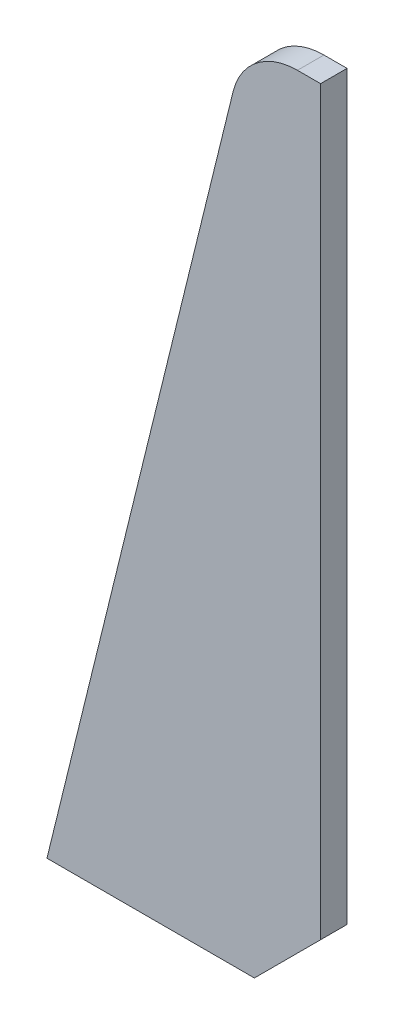
ISO-10303-21;
HEADER;
FILE_DESCRIPTION(('STEP AP214'),'2;1');
FILE_NAME('part.step','',(''),(''),'','','');
FILE_SCHEMA(('AUTOMOTIVE_DESIGN { 1 0 10303 214 1 1 1 1 }'));
ENDSEC;
DATA;
#1=APPLICATION_CONTEXT('core data for automotive mechanical design processes');
#2=APPLICATION_PROTOCOL_DEFINITION('international standard','automotive_design',2000,#1);
#3=PRODUCT_CONTEXT('',#1,'mechanical');
#4=PRODUCT('Part','Part','',(#3));
#5=PRODUCT_RELATED_PRODUCT_CATEGORY('part','',(#4));
#6=PRODUCT_DEFINITION_FORMATION('','',#4);
#7=PRODUCT_DEFINITION_CONTEXT('part definition',#1,'design');
#8=PRODUCT_DEFINITION('design','',#6,#7);
#9=PRODUCT_DEFINITION_SHAPE('','',#8);
#10=(LENGTH_UNIT() NAMED_UNIT(*) SI_UNIT(.MILLI.,.METRE.));
#11=(NAMED_UNIT(*) PLANE_ANGLE_UNIT() SI_UNIT($,.RADIAN.));
#12=(NAMED_UNIT(*) SI_UNIT($,.STERADIAN.) SOLID_ANGLE_UNIT());
#13=UNCERTAINTY_MEASURE_WITH_UNIT(LENGTH_MEASURE(1.E-05),#10,'distance_accuracy_value','');
#14=(GEOMETRIC_REPRESENTATION_CONTEXT(3) GLOBAL_UNCERTAINTY_ASSIGNED_CONTEXT((#13)) GLOBAL_UNIT_ASSIGNED_CONTEXT((#10,
#11,#12)) REPRESENTATION_CONTEXT('',''));
#15=CARTESIAN_POINT('',(0.,0.,0.));
#16=DIRECTION('',(0.,0.,1.));
#17=DIRECTION('',(1.,0.,0.));
#18=AXIS2_PLACEMENT_3D('',#15,#16,#17);
#19=CARTESIAN_POINT('',(-62.,0.,-6.));
#20=DIRECTION('',(0.,-1.,0.));
#21=DIRECTION('',(1.,0.,0.));
#22=AXIS2_PLACEMENT_3D('',#19,#20,#21);
#23=PLANE('',#22);
#24=DIRECTION('',(1.,0.,0.));
#25=VECTOR('',#24,1.);
#26=CARTESIAN_POINT('',(-62.,0.,-6.));
#27=LINE('',#26,#25);
#28=CARTESIAN_POINT('',(-62.,0.,-6.));
#29=VERTEX_POINT('',#28);
#30=CARTESIAN_POINT('',(-15.,0.,-6.));
#31=VERTEX_POINT('',#30);
#32=EDGE_CURVE('E127',#29,#31,#27,.T.);
#33=ORIENTED_EDGE('',*,*,#32,.T.);
#34=DIRECTION('',(0.,0.,1.));
#35=VECTOR('',#34,1.);
#36=CARTESIAN_POINT('',(-15.,0.,0.));
#37=LINE('',#36,#35);
#38=CARTESIAN_POINT('',(-15.,0.,0.));
#39=VERTEX_POINT('',#38);
#40=EDGE_CURVE('E157',#31,#39,#37,.T.);
#41=ORIENTED_EDGE('',*,*,#40,.T.);
#42=DIRECTION('',(1.,0.,0.));
#43=VECTOR('',#42,1.);
#44=CARTESIAN_POINT('',(-62.,0.,0.));
#45=LINE('',#44,#43);
#46=CARTESIAN_POINT('',(-62.,0.,0.));
#47=VERTEX_POINT('',#46);
#48=EDGE_CURVE('E122',#47,#39,#45,.T.);
#49=ORIENTED_EDGE('',*,*,#48,.F.);
#50=DIRECTION('',(0.,0.,1.));
#51=VECTOR('',#50,1.);
#52=CARTESIAN_POINT('',(-62.,0.,-6.));
#53=LINE('',#52,#51);
#54=EDGE_CURVE('E135',#29,#47,#53,.T.);
#55=ORIENTED_EDGE('',*,*,#54,.F.);
#56=EDGE_LOOP('',(#33,#41,#49,#55));
#57=FACE_BOUND('',#56,.T.);
#58=ADVANCED_FACE('F46',(#57),#23,.T.);
#59=CARTESIAN_POINT('',(-17.,183.,-6.));
#60=DIRECTION('',(-0.971071693103805,0.238788121255034,0.));
#61=DIRECTION('',(-0.238788121255034,-0.971071693103806,0.));
#62=AXIS2_PLACEMENT_3D('',#59,#60,#61);
#63=PLANE('',#62);
#64=DIRECTION('',(-0.238788121255034,-0.971071693103805,0.));
#65=VECTOR('',#64,1.);
#66=CARTESIAN_POINT('',(-17.,183.,0.));
#67=LINE('',#66,#65);
#68=CARTESIAN_POINT('',(-19.8077487330757,171.581821818825,0.));
#69=VERTEX_POINT('',#68);
#70=EDGE_CURVE('E129',#69,#47,#67,.T.);
#71=ORIENTED_EDGE('',*,*,#70,.F.);
#72=DIRECTION('',(0.,0.,1.));
#73=VECTOR('',#72,1.);
#74=CARTESIAN_POINT('',(-19.8077487330757,171.581821818825,-6.));
#75=LINE('',#74,#73);
#76=CARTESIAN_POINT('',(-19.8077487330757,171.581821818825,-6.));
#77=VERTEX_POINT('',#76);
#78=EDGE_CURVE('E149',#69,#77,#75,.F.);
#79=ORIENTED_EDGE('',*,*,#78,.T.);
#80=DIRECTION('',(-0.238788121255034,-0.971071693103805,0.));
#81=VECTOR('',#80,1.);
#82=CARTESIAN_POINT('',(-17.,183.,-6.));
#83=LINE('',#82,#81);
#84=EDGE_CURVE('E121',#77,#29,#83,.T.);
#85=ORIENTED_EDGE('',*,*,#84,.T.);
#86=ORIENTED_EDGE('',*,*,#54,.T.);
#87=EDGE_LOOP('',(#71,#79,#85,#86));
#88=FACE_BOUND('',#87,.T.);
#89=ADVANCED_FACE('F186',(#88),#63,.T.);
#90=CARTESIAN_POINT('',(33.,183.,-6.));
#91=DIRECTION('',(0.,1.,0.));
#92=DIRECTION('',(0.,0.,1.));
#93=AXIS2_PLACEMENT_3D('',#90,#91,#92);
#94=PLANE('',#93);
#95=DIRECTION('',(0.,0.,1.));
#96=VECTOR('',#95,1.);
#97=CARTESIAN_POINT('',(0.,183.,-6.));
#98=LINE('',#97,#96);
#99=CARTESIAN_POINT('',(0.,183.,-6.));
#100=VERTEX_POINT('',#99);
#101=CARTESIAN_POINT('',(0.,183.,0.));
#102=VERTEX_POINT('',#101);
#103=EDGE_CURVE('E100',#100,#102,#98,.T.);
#104=ORIENTED_EDGE('',*,*,#103,.F.);
#105=DIRECTION('',(-1.,0.,0.));
#106=VECTOR('',#105,1.);
#107=CARTESIAN_POINT('',(33.,183.,-6.));
#108=LINE('',#107,#106);
#109=CARTESIAN_POINT('',(-5.24167333651864,183.,-6.));
#110=VERTEX_POINT('',#109);
#111=EDGE_CURVE('E110',#100,#110,#108,.T.);
#112=ORIENTED_EDGE('',*,*,#111,.T.);
#113=DIRECTION('',(0.,0.,1.));
#114=VECTOR('',#113,1.);
#115=CARTESIAN_POINT('',(-5.24167333651864,183.,-6.));
#116=LINE('',#115,#114);
#117=CARTESIAN_POINT('',(-5.24167333651864,183.,0.));
#118=VERTEX_POINT('',#117);
#119=EDGE_CURVE('E143',#110,#118,#116,.T.);
#120=ORIENTED_EDGE('',*,*,#119,.T.);
#121=DIRECTION('',(-1.,0.,0.));
#122=VECTOR('',#121,1.);
#123=CARTESIAN_POINT('',(33.,183.,0.));
#124=LINE('',#123,#122);
#125=EDGE_CURVE('E112',#102,#118,#124,.T.);
#126=ORIENTED_EDGE('',*,*,#125,.F.);
#127=EDGE_LOOP('',(#104,#112,#120,#126));
#128=FACE_BOUND('',#127,.T.);
#129=ADVANCED_FACE('F108',(#128),#94,.T.);
#130=CARTESIAN_POINT('',(0.,0.,-6.));
#131=DIRECTION('',(0.,0.,1.));
#132=DIRECTION('',(1.,0.,0.));
#133=AXIS2_PLACEMENT_3D('',#130,#131,#132);
#134=PLANE('',#133);
#135=DIRECTION('',(0.,-1.,0.));
#136=VECTOR('',#135,1.);
#137=CARTESIAN_POINT('',(0.,0.,-6.));
#138=LINE('',#137,#136);
#139=CARTESIAN_POINT('',(0.,15.0000000000001,-6.));
#140=VERTEX_POINT('',#139);
#141=EDGE_CURVE('E97',#100,#140,#138,.T.);
#142=ORIENTED_EDGE('',*,*,#141,.T.);
#143=DIRECTION('',(-0.707106781186546,-0.707106781186549,0.));
#144=VECTOR('',#143,1.);
#145=CARTESIAN_POINT('',(-15.,0.,-6.));
#146=LINE('',#145,#144);
#147=EDGE_CURVE('E11',#140,#31,#146,.T.);
#148=ORIENTED_EDGE('',*,*,#147,.T.);
#149=ORIENTED_EDGE('',*,*,#32,.F.);
#150=ORIENTED_EDGE('',*,*,#84,.F.);
#151=CARTESIAN_POINT('',(-5.24167333651864,168.,-6.));
#152=DIRECTION('',(0.,0.,1.));
#153=DIRECTION('',(1.,0.,0.));
#154=AXIS2_PLACEMENT_3D('',#151,#152,#153);
#155=CIRCLE('',#154,15.);
#156=EDGE_CURVE('E118',#77,#110,#155,.F.);
#157=ORIENTED_EDGE('',*,*,#156,.T.);
#158=ORIENTED_EDGE('',*,*,#111,.F.);
#159=EDGE_LOOP('',(#142,#148,#149,#150,#157,#158));
#160=FACE_BOUND('',#159,.T.);
#161=ADVANCED_FACE('F115',(#160),#134,.F.);
#162=CARTESIAN_POINT('',(0.,0.,0.));
#163=DIRECTION('',(0.,0.,1.));
#164=DIRECTION('',(1.,0.,0.));
#165=AXIS2_PLACEMENT_3D('',#162,#163,#164);
#166=PLANE('',#165);
#167=ORIENTED_EDGE('',*,*,#48,.T.);
#168=DIRECTION('',(0.707106781186546,0.707106781186549,0.));
#169=VECTOR('',#168,1.);
#170=CARTESIAN_POINT('',(-7.50000000000004,7.50000000000001,0.));
#171=LINE('',#170,#169);
#172=CARTESIAN_POINT('',(0.,15.0000000000001,0.));
#173=VERTEX_POINT('',#172);
#174=EDGE_CURVE('E70',#39,#173,#171,.T.);
#175=ORIENTED_EDGE('',*,*,#174,.T.);
#176=DIRECTION('',(0.,-1.,0.));
#177=VECTOR('',#176,1.);
#178=CARTESIAN_POINT('',(0.,0.,0.));
#179=LINE('',#178,#177);
#180=EDGE_CURVE('E154',#102,#173,#179,.T.);
#181=ORIENTED_EDGE('',*,*,#180,.F.);
#182=ORIENTED_EDGE('',*,*,#125,.T.);
#183=CARTESIAN_POINT('',(-5.24167333651864,168.,0.));
#184=DIRECTION('',(0.,0.,1.));
#185=DIRECTION('',(1.,0.,0.));
#186=AXIS2_PLACEMENT_3D('',#183,#184,#185);
#187=CIRCLE('',#186,15.);
#188=EDGE_CURVE('E146',#118,#69,#187,.T.);
#189=ORIENTED_EDGE('',*,*,#188,.T.);
#190=ORIENTED_EDGE('',*,*,#70,.T.);
#191=EDGE_LOOP('',(#167,#175,#181,#182,#189,#190));
#192=FACE_BOUND('',#191,.T.);
#193=ADVANCED_FACE('F181',(#192),#166,.T.);
#194=CARTESIAN_POINT('',(-5.24167333651864,168.,-6.));
#195=DIRECTION('',(0.,0.,1.));
#196=DIRECTION('',(1.,0.,0.));
#197=AXIS2_PLACEMENT_3D('',#194,#195,#196);
#198=CYLINDRICAL_SURFACE('',#197,15.);
#199=ORIENTED_EDGE('',*,*,#156,.F.);
#200=ORIENTED_EDGE('',*,*,#78,.F.);
#201=ORIENTED_EDGE('',*,*,#188,.F.);
#202=ORIENTED_EDGE('',*,*,#119,.F.);
#203=EDGE_LOOP('',(#199,#200,#201,#202));
#204=FACE_BOUND('',#203,.T.);
#205=ADVANCED_FACE('F191',(#204),#198,.T.);
#206=CARTESIAN_POINT('',(0.,0.,-6.));
#207=DIRECTION('',(-1.,0.,0.));
#208=DIRECTION('',(0.,0.,1.));
#209=AXIS2_PLACEMENT_3D('',#206,#207,#208);
#210=PLANE('',#209);
#211=ORIENTED_EDGE('',*,*,#180,.T.);
#212=DIRECTION('',(0.,0.,-1.));
#213=VECTOR('',#212,1.);
#214=CARTESIAN_POINT('',(0.,15.0000000000001,-6.));
#215=LINE('',#214,#213);
#216=EDGE_CURVE('E56',#173,#140,#215,.T.);
#217=ORIENTED_EDGE('',*,*,#216,.T.);
#218=ORIENTED_EDGE('',*,*,#141,.F.);
#219=ORIENTED_EDGE('',*,*,#103,.T.);
#220=EDGE_LOOP('',(#211,#217,#218,#219));
#221=FACE_BOUND('',#220,.T.);
#222=ADVANCED_FACE('F99',(#221),#210,.F.);
#223=CARTESIAN_POINT('',(-15.,0.,-6.));
#224=DIRECTION('',(0.707106781186549,-0.707106781186546,0.));
#225=DIRECTION('',(0.,0.,-1.));
#226=AXIS2_PLACEMENT_3D('',#223,#224,#225);
#227=PLANE('',#226);
#228=ORIENTED_EDGE('',*,*,#147,.F.);
#229=ORIENTED_EDGE('',*,*,#216,.F.);
#230=ORIENTED_EDGE('',*,*,#174,.F.);
#231=ORIENTED_EDGE('',*,*,#40,.F.);
#232=EDGE_LOOP('',(#228,#229,#230,#231));
#233=FACE_BOUND('',#232,.T.);
#234=ADVANCED_FACE('F49',(#233),#227,.T.);
#235=CLOSED_SHELL('',(#58,#89,#129,#161,#193,#205,#222,#234));
#236=MANIFOLD_SOLID_BREP('B2',#235);
#237=ADVANCED_BREP_SHAPE_REPRESENTATION('',(#18,#236),#14);
#238=SHAPE_DEFINITION_REPRESENTATION(#9,#237);
ENDSEC;
END-ISO-10303-21;
